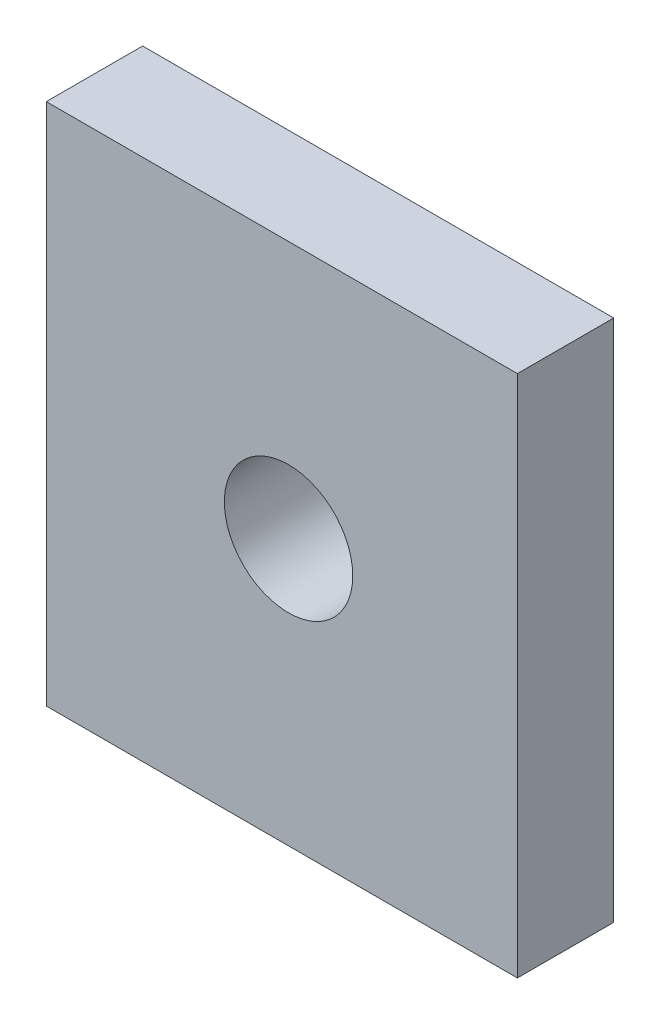
ISO-10303-21;
HEADER;
FILE_DESCRIPTION(('STEP AP214'),'2;1');
FILE_NAME('part.step','',(''),(''),'','','');
FILE_SCHEMA(('AUTOMOTIVE_DESIGN { 1 0 10303 214 1 1 1 1 }'));
ENDSEC;
DATA;
#1=APPLICATION_CONTEXT('core data for automotive mechanical design processes');
#2=APPLICATION_PROTOCOL_DEFINITION('international standard','automotive_design',2000,#1);
#3=PRODUCT_CONTEXT('',#1,'mechanical');
#4=PRODUCT('Part','Part','',(#3));
#5=PRODUCT_RELATED_PRODUCT_CATEGORY('part','',(#4));
#6=PRODUCT_DEFINITION_FORMATION('','',#4);
#7=PRODUCT_DEFINITION_CONTEXT('part definition',#1,'design');
#8=PRODUCT_DEFINITION('design','',#6,#7);
#9=PRODUCT_DEFINITION_SHAPE('','',#8);
#10=(LENGTH_UNIT() NAMED_UNIT(*) SI_UNIT(.MILLI.,.METRE.));
#11=(NAMED_UNIT(*) PLANE_ANGLE_UNIT() SI_UNIT($,.RADIAN.));
#12=(NAMED_UNIT(*) SI_UNIT($,.STERADIAN.) SOLID_ANGLE_UNIT());
#13=UNCERTAINTY_MEASURE_WITH_UNIT(LENGTH_MEASURE(1.E-05),#10,'distance_accuracy_value','');
#14=(GEOMETRIC_REPRESENTATION_CONTEXT(3) GLOBAL_UNCERTAINTY_ASSIGNED_CONTEXT((#13)) GLOBAL_UNIT_ASSIGNED_CONTEXT((#10,
#11,#12)) REPRESENTATION_CONTEXT('',''));
#15=CARTESIAN_POINT('',(0.,0.,0.));
#16=DIRECTION('',(0.,0.,1.));
#17=DIRECTION('',(1.,0.,0.));
#18=AXIS2_PLACEMENT_3D('',#15,#16,#17);
#19=CARTESIAN_POINT('',(0.,0.,15.));
#20=DIRECTION('',(0.,0.,1.));
#21=DIRECTION('',(1.,0.,0.));
#22=AXIS2_PLACEMENT_3D('',#19,#20,#21);
#23=PLANE('',#22);
#24=DIRECTION('',(0.,-1.,0.));
#25=VECTOR('',#24,1.);
#26=CARTESIAN_POINT('',(-37.7269694806028,40.0967539957159,15.));
#27=LINE('',#26,#25);
#28=CARTESIAN_POINT('',(-37.7269694806028,40.0967539957159,15.));
#29=VERTEX_POINT('',#28);
#30=CARTESIAN_POINT('',(-37.7269694806027,-41.4238333241794,15.));
#31=VERTEX_POINT('',#30);
#32=EDGE_CURVE('E85',#29,#31,#27,.T.);
#33=ORIENTED_EDGE('',*,*,#32,.T.);
#34=DIRECTION('',(1.,0.,0.));
#35=VECTOR('',#34,1.);
#36=CARTESIAN_POINT('',(-37.7269694806027,-41.4238333241794,15.));
#37=LINE('',#36,#35);
#38=CARTESIAN_POINT('',(35.641559107303,-41.4238333241794,15.));
#39=VERTEX_POINT('',#38);
#40=EDGE_CURVE('E80',#31,#39,#37,.T.);
#41=ORIENTED_EDGE('',*,*,#40,.T.);
#42=DIRECTION('',(0.,1.,0.));
#43=VECTOR('',#42,1.);
#44=CARTESIAN_POINT('',(35.641559107303,40.0967539957159,15.));
#45=LINE('',#44,#43);
#46=CARTESIAN_POINT('',(35.641559107303,40.0967539957159,15.));
#47=VERTEX_POINT('',#46);
#48=EDGE_CURVE('E83',#39,#47,#45,.T.);
#49=ORIENTED_EDGE('',*,*,#48,.T.);
#50=DIRECTION('',(-1.,0.,0.));
#51=VECTOR('',#50,1.);
#52=CARTESIAN_POINT('',(-37.7269694806028,40.0967539957159,15.));
#53=LINE('',#52,#51);
#54=EDGE_CURVE('E50',#47,#29,#53,.T.);
#55=ORIENTED_EDGE('',*,*,#54,.T.);
#56=EDGE_LOOP('',(#33,#41,#49,#55));
#57=FACE_BOUND('',#56,.T.);
#58=CARTESIAN_POINT('',(0.,0.,15.));
#59=DIRECTION('',(0.,0.,1.));
#60=DIRECTION('',(1.,0.,0.));
#61=AXIS2_PLACEMENT_3D('',#58,#59,#60);
#62=CIRCLE('',#61,10.);
#63=CARTESIAN_POINT('',(10.,0.,15.));
#64=VERTEX_POINT('',#63);
#65=EDGE_CURVE('E100',#64,#64,#62,.T.);
#66=ORIENTED_EDGE('',*,*,#65,.F.);
#67=EDGE_LOOP('',(#66));
#68=FACE_BOUND('',#67,.T.);
#69=ADVANCED_FACE('F33',(#57,#68),#23,.T.);
#70=CARTESIAN_POINT('',(0.,0.,0.));
#71=DIRECTION('',(0.,0.,1.));
#72=DIRECTION('',(1.,0.,0.));
#73=AXIS2_PLACEMENT_3D('',#70,#71,#72);
#74=PLANE('',#73);
#75=DIRECTION('',(0.,-1.,0.));
#76=VECTOR('',#75,1.);
#77=CARTESIAN_POINT('',(-37.7269694806028,40.0967539957159,0.));
#78=LINE('',#77,#76);
#79=CARTESIAN_POINT('',(-37.7269694806028,40.0967539957159,0.));
#80=VERTEX_POINT('',#79);
#81=CARTESIAN_POINT('',(-37.7269694806027,-41.4238333241794,0.));
#82=VERTEX_POINT('',#81);
#83=EDGE_CURVE('E97',#80,#82,#78,.T.);
#84=ORIENTED_EDGE('',*,*,#83,.F.);
#85=DIRECTION('',(-1.,0.,0.));
#86=VECTOR('',#85,1.);
#87=CARTESIAN_POINT('',(-37.7269694806028,40.0967539957159,0.));
#88=LINE('',#87,#86);
#89=CARTESIAN_POINT('',(35.641559107303,40.0967539957159,0.));
#90=VERTEX_POINT('',#89);
#91=EDGE_CURVE('E73',#90,#80,#88,.T.);
#92=ORIENTED_EDGE('',*,*,#91,.F.);
#93=DIRECTION('',(0.,1.,0.));
#94=VECTOR('',#93,1.);
#95=CARTESIAN_POINT('',(35.641559107303,40.0967539957159,0.));
#96=LINE('',#95,#94);
#97=CARTESIAN_POINT('',(35.641559107303,-41.4238333241794,0.));
#98=VERTEX_POINT('',#97);
#99=EDGE_CURVE('E67',#98,#90,#96,.T.);
#100=ORIENTED_EDGE('',*,*,#99,.F.);
#101=DIRECTION('',(1.,0.,0.));
#102=VECTOR('',#101,1.);
#103=CARTESIAN_POINT('',(-37.7269694806027,-41.4238333241794,0.));
#104=LINE('',#103,#102);
#105=EDGE_CURVE('E89',#82,#98,#104,.T.);
#106=ORIENTED_EDGE('',*,*,#105,.F.);
#107=EDGE_LOOP('',(#84,#92,#100,#106));
#108=FACE_BOUND('',#107,.T.);
#109=CARTESIAN_POINT('',(0.,0.,0.));
#110=DIRECTION('',(0.,0.,1.));
#111=DIRECTION('',(1.,0.,0.));
#112=AXIS2_PLACEMENT_3D('',#109,#110,#111);
#113=CIRCLE('',#112,10.);
#114=CARTESIAN_POINT('',(10.,0.,0.));
#115=VERTEX_POINT('',#114);
#116=EDGE_CURVE('E112',#115,#115,#113,.T.);
#117=ORIENTED_EDGE('',*,*,#116,.T.);
#118=EDGE_LOOP('',(#117));
#119=FACE_BOUND('',#118,.T.);
#120=ADVANCED_FACE('F108',(#108,#119),#74,.F.);
#121=CARTESIAN_POINT('',(-37.7269694806028,40.0967539957159,15.));
#122=DIRECTION('',(1.,0.,0.));
#123=DIRECTION('',(0.,1.,0.));
#124=AXIS2_PLACEMENT_3D('',#121,#122,#123);
#125=PLANE('',#124);
#126=ORIENTED_EDGE('',*,*,#83,.T.);
#127=DIRECTION('',(0.,0.,-1.));
#128=VECTOR('',#127,1.);
#129=CARTESIAN_POINT('',(-37.7269694806027,-41.4238333241794,15.));
#130=LINE('',#129,#128);
#131=EDGE_CURVE('E11',#31,#82,#130,.T.);
#132=ORIENTED_EDGE('',*,*,#131,.F.);
#133=ORIENTED_EDGE('',*,*,#32,.F.);
#134=DIRECTION('',(0.,0.,-1.));
#135=VECTOR('',#134,1.);
#136=CARTESIAN_POINT('',(-37.7269694806028,40.0967539957159,15.));
#137=LINE('',#136,#135);
#138=EDGE_CURVE('E93',#29,#80,#137,.T.);
#139=ORIENTED_EDGE('',*,*,#138,.T.);
#140=EDGE_LOOP('',(#126,#132,#133,#139));
#141=FACE_BOUND('',#140,.T.);
#142=ADVANCED_FACE('F35',(#141),#125,.F.);
#143=CARTESIAN_POINT('',(-37.7269694806027,-41.4238333241794,15.));
#144=DIRECTION('',(0.,1.,0.));
#145=DIRECTION('',(0.,0.,1.));
#146=AXIS2_PLACEMENT_3D('',#143,#144,#145);
#147=PLANE('',#146);
#148=ORIENTED_EDGE('',*,*,#105,.T.);
#149=DIRECTION('',(0.,0.,-1.));
#150=VECTOR('',#149,1.);
#151=CARTESIAN_POINT('',(35.641559107303,-41.4238333241794,15.));
#152=LINE('',#151,#150);
#153=EDGE_CURVE('E42',#39,#98,#152,.T.);
#154=ORIENTED_EDGE('',*,*,#153,.F.);
#155=ORIENTED_EDGE('',*,*,#40,.F.);
#156=ORIENTED_EDGE('',*,*,#131,.T.);
#157=EDGE_LOOP('',(#148,#154,#155,#156));
#158=FACE_BOUND('',#157,.T.);
#159=ADVANCED_FACE('F88',(#158),#147,.F.);
#160=CARTESIAN_POINT('',(35.641559107303,40.0967539957159,15.));
#161=DIRECTION('',(-1.,0.,0.));
#162=DIRECTION('',(0.,-1.,0.));
#163=AXIS2_PLACEMENT_3D('',#160,#161,#162);
#164=PLANE('',#163);
#165=ORIENTED_EDGE('',*,*,#99,.T.);
#166=DIRECTION('',(0.,0.,-1.));
#167=VECTOR('',#166,1.);
#168=CARTESIAN_POINT('',(35.641559107303,40.0967539957159,15.));
#169=LINE('',#168,#167);
#170=EDGE_CURVE('E90',#47,#90,#169,.T.);
#171=ORIENTED_EDGE('',*,*,#170,.F.);
#172=ORIENTED_EDGE('',*,*,#48,.F.);
#173=ORIENTED_EDGE('',*,*,#153,.T.);
#174=EDGE_LOOP('',(#165,#171,#172,#173));
#175=FACE_BOUND('',#174,.T.);
#176=ADVANCED_FACE('F91',(#175),#164,.F.);
#177=CARTESIAN_POINT('',(-37.7269694806028,40.0967539957159,15.));
#178=DIRECTION('',(0.,-1.,0.));
#179=DIRECTION('',(0.,0.,-1.));
#180=AXIS2_PLACEMENT_3D('',#177,#178,#179);
#181=PLANE('',#180);
#182=ORIENTED_EDGE('',*,*,#91,.T.);
#183=ORIENTED_EDGE('',*,*,#138,.F.);
#184=ORIENTED_EDGE('',*,*,#54,.F.);
#185=ORIENTED_EDGE('',*,*,#170,.T.);
#186=EDGE_LOOP('',(#182,#183,#184,#185));
#187=FACE_BOUND('',#186,.T.);
#188=ADVANCED_FACE('F105',(#187),#181,.F.);
#189=CARTESIAN_POINT('',(0.,0.,15.));
#190=DIRECTION('',(0.,0.,-1.));
#191=DIRECTION('',(-1.,0.,0.));
#192=AXIS2_PLACEMENT_3D('',#189,#190,#191);
#193=CYLINDRICAL_SURFACE('',#192,10.);
#194=ORIENTED_EDGE('',*,*,#65,.T.);
#195=EDGE_LOOP('',(#194));
#196=FACE_BOUND('',#195,.T.);
#197=ORIENTED_EDGE('',*,*,#116,.F.);
#198=EDGE_LOOP('',(#197));
#199=FACE_BOUND('',#198,.T.);
#200=ADVANCED_FACE('F118',(#196,#199),#193,.F.);
#201=CLOSED_SHELL('',(#69,#120,#142,#159,#176,#188,#200));
#202=MANIFOLD_SOLID_BREP('B2',#201);
#203=ADVANCED_BREP_SHAPE_REPRESENTATION('',(#18,#202),#14);
#204=SHAPE_DEFINITION_REPRESENTATION(#9,#203);
ENDSEC;
END-ISO-10303-21;
